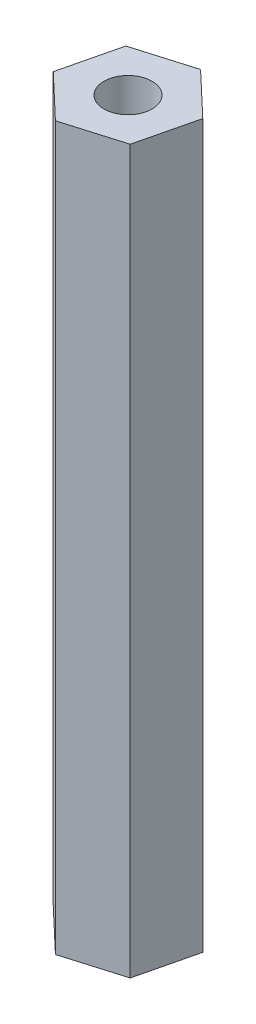
ISO-10303-21;
HEADER;
FILE_DESCRIPTION(('STEP AP214'),'2;1');
FILE_NAME('part.step','',(''),(''),'','','');
FILE_SCHEMA(('AUTOMOTIVE_DESIGN { 1 0 10303 214 1 1 1 1 }'));
ENDSEC;
DATA;
#1=APPLICATION_CONTEXT('core data for automotive mechanical design processes');
#2=APPLICATION_PROTOCOL_DEFINITION('international standard','automotive_design',2000,#1);
#3=PRODUCT_CONTEXT('',#1,'mechanical');
#4=PRODUCT('Part','Part','',(#3));
#5=PRODUCT_RELATED_PRODUCT_CATEGORY('part','',(#4));
#6=PRODUCT_DEFINITION_FORMATION('','',#4);
#7=PRODUCT_DEFINITION_CONTEXT('part definition',#1,'design');
#8=PRODUCT_DEFINITION('design','',#6,#7);
#9=PRODUCT_DEFINITION_SHAPE('','',#8);
#10=(LENGTH_UNIT() NAMED_UNIT(*) SI_UNIT(.MILLI.,.METRE.));
#11=(NAMED_UNIT(*) PLANE_ANGLE_UNIT() SI_UNIT($,.RADIAN.));
#12=(NAMED_UNIT(*) SI_UNIT($,.STERADIAN.) SOLID_ANGLE_UNIT());
#13=UNCERTAINTY_MEASURE_WITH_UNIT(LENGTH_MEASURE(1.E-05),#10,'distance_accuracy_value','');
#14=(GEOMETRIC_REPRESENTATION_CONTEXT(3) GLOBAL_UNCERTAINTY_ASSIGNED_CONTEXT((#13)) GLOBAL_UNIT_ASSIGNED_CONTEXT((#10,
#11,#12)) REPRESENTATION_CONTEXT('',''));
#15=CARTESIAN_POINT('',(0.,0.,0.));
#16=DIRECTION('',(0.,0.,1.));
#17=DIRECTION('',(1.,0.,0.));
#18=AXIS2_PLACEMENT_3D('',#15,#16,#17);
#19=CARTESIAN_POINT('',(0.,60.,0.));
#20=DIRECTION('',(0.,1.,0.));
#21=DIRECTION('',(0.,0.,1.));
#22=AXIS2_PLACEMENT_3D('',#19,#20,#21);
#23=PLANE('',#22);
#24=DIRECTION('',(0.958974247658191,0.,-0.283493196264754));
#25=VECTOR('',#24,1.);
#26=CARTESIAN_POINT('',(-1.16987407031886,60.,4.8612132908972));
#27=LINE('',#26,#25);
#28=CARTESIAN_POINT('',(-1.16987407031886,60.,4.8612132908972));
#29=VERTEX_POINT('',#28);
#30=CARTESIAN_POINT('',(3.6249971679721,60.,3.44374730957343));
#31=VERTEX_POINT('',#30);
#32=EDGE_CURVE('E181',#29,#31,#27,.T.);
#33=ORIENTED_EDGE('',*,*,#32,.T.);
#34=DIRECTION('',(0.233974814063771,0.,-0.97224265817944));
#35=VECTOR('',#34,1.);
#36=CARTESIAN_POINT('',(3.6249971679721,60.,3.44374730957343));
#37=LINE('',#36,#35);
#38=CARTESIAN_POINT('',(4.79487123829096,60.,-1.41746598132377));
#39=VERTEX_POINT('',#38);
#40=EDGE_CURVE('E139',#31,#39,#37,.T.);
#41=ORIENTED_EDGE('',*,*,#40,.T.);
#42=DIRECTION('',(-0.72499943359442,0.,-0.688749461914687));
#43=VECTOR('',#42,1.);
#44=CARTESIAN_POINT('',(4.79487123829096,60.,-1.41746598132377));
#45=LINE('',#44,#43);
#46=CARTESIAN_POINT('',(1.16987407031886,60.,-4.8612132908972));
#47=VERTEX_POINT('',#46);
#48=EDGE_CURVE('E152',#39,#47,#45,.T.);
#49=ORIENTED_EDGE('',*,*,#48,.T.);
#50=DIRECTION('',(-0.958974247658191,0.,0.283493196264754));
#51=VECTOR('',#50,1.);
#52=CARTESIAN_POINT('',(1.16987407031886,60.,-4.8612132908972));
#53=LINE('',#52,#51);
#54=CARTESIAN_POINT('',(-3.6249971679721,60.,-3.44374730957343));
#55=VERTEX_POINT('',#54);
#56=EDGE_CURVE('E146',#47,#55,#53,.T.);
#57=ORIENTED_EDGE('',*,*,#56,.T.);
#58=DIRECTION('',(-0.233974814063771,0.,0.97224265817944));
#59=VECTOR('',#58,1.);
#60=CARTESIAN_POINT('',(-3.6249971679721,60.,-3.44374730957343));
#61=LINE('',#60,#59);
#62=CARTESIAN_POINT('',(-4.79487123829096,60.,1.41746598132377));
#63=VERTEX_POINT('',#62);
#64=EDGE_CURVE('E150',#55,#63,#61,.T.);
#65=ORIENTED_EDGE('',*,*,#64,.T.);
#66=DIRECTION('',(0.72499943359442,0.,0.688749461914687));
#67=VECTOR('',#66,1.);
#68=CARTESIAN_POINT('',(-4.79487123829096,60.,1.41746598132377));
#69=LINE('',#68,#67);
#70=EDGE_CURVE('E102',#63,#29,#69,.T.);
#71=ORIENTED_EDGE('',*,*,#70,.T.);
#72=EDGE_LOOP('',(#33,#41,#49,#57,#65,#71));
#73=FACE_BOUND('',#72,.T.);
#74=CARTESIAN_POINT('',(0.,60.,0.));
#75=DIRECTION('',(0.,1.,0.));
#76=DIRECTION('',(0.,0.,1.));
#77=AXIS2_PLACEMENT_3D('',#74,#75,#76);
#78=CIRCLE('',#77,2.);
#79=CARTESIAN_POINT('',(0.,60.,2.));
#80=VERTEX_POINT('',#79);
#81=EDGE_CURVE('E316',#80,#80,#78,.T.);
#82=ORIENTED_EDGE('',*,*,#81,.F.);
#83=EDGE_LOOP('',(#82));
#84=FACE_BOUND('',#83,.T.);
#85=ADVANCED_FACE('F85',(#73,#84),#23,.T.);
#86=CARTESIAN_POINT('',(0.,0.,0.));
#87=DIRECTION('',(0.,1.,0.));
#88=DIRECTION('',(0.,0.,1.));
#89=AXIS2_PLACEMENT_3D('',#86,#87,#88);
#90=PLANE('',#89);
#91=DIRECTION('',(0.958974247658191,0.,-0.283493196264754));
#92=VECTOR('',#91,1.);
#93=CARTESIAN_POINT('',(-1.16987407031886,0.,4.8612132908972));
#94=LINE('',#93,#92);
#95=CARTESIAN_POINT('',(-1.16987407031886,0.,4.8612132908972));
#96=VERTEX_POINT('',#95);
#97=CARTESIAN_POINT('',(3.6249971679721,0.,3.44374730957343));
#98=VERTEX_POINT('',#97);
#99=EDGE_CURVE('E170',#96,#98,#94,.T.);
#100=ORIENTED_EDGE('',*,*,#99,.F.);
#101=DIRECTION('',(0.72499943359442,0.,0.688749461914687));
#102=VECTOR('',#101,1.);
#103=CARTESIAN_POINT('',(-4.79487123829096,0.,1.41746598132377));
#104=LINE('',#103,#102);
#105=CARTESIAN_POINT('',(-4.79487123829096,0.,1.41746598132377));
#106=VERTEX_POINT('',#105);
#107=EDGE_CURVE('E131',#106,#96,#104,.T.);
#108=ORIENTED_EDGE('',*,*,#107,.F.);
#109=DIRECTION('',(-0.233974814063771,0.,0.97224265817944));
#110=VECTOR('',#109,1.);
#111=CARTESIAN_POINT('',(-3.6249971679721,0.,-3.44374730957343));
#112=LINE('',#111,#110);
#113=CARTESIAN_POINT('',(-3.6249971679721,0.,-3.44374730957343));
#114=VERTEX_POINT('',#113);
#115=EDGE_CURVE('E125',#114,#106,#112,.T.);
#116=ORIENTED_EDGE('',*,*,#115,.F.);
#117=DIRECTION('',(-0.958974247658191,0.,0.283493196264754));
#118=VECTOR('',#117,1.);
#119=CARTESIAN_POINT('',(1.16987407031886,0.,-4.8612132908972));
#120=LINE('',#119,#118);
#121=CARTESIAN_POINT('',(1.16987407031886,0.,-4.8612132908972));
#122=VERTEX_POINT('',#121);
#123=EDGE_CURVE('E160',#122,#114,#120,.T.);
#124=ORIENTED_EDGE('',*,*,#123,.F.);
#125=DIRECTION('',(-0.72499943359442,0.,-0.688749461914687));
#126=VECTOR('',#125,1.);
#127=CARTESIAN_POINT('',(4.79487123829096,0.,-1.41746598132377));
#128=LINE('',#127,#126);
#129=CARTESIAN_POINT('',(4.79487123829096,0.,-1.41746598132377));
#130=VERTEX_POINT('',#129);
#131=EDGE_CURVE('E176',#130,#122,#128,.T.);
#132=ORIENTED_EDGE('',*,*,#131,.F.);
#133=DIRECTION('',(0.233974814063771,0.,-0.97224265817944));
#134=VECTOR('',#133,1.);
#135=CARTESIAN_POINT('',(3.6249971679721,0.,3.44374730957343));
#136=LINE('',#135,#134);
#137=EDGE_CURVE('E173',#98,#130,#136,.T.);
#138=ORIENTED_EDGE('',*,*,#137,.F.);
#139=EDGE_LOOP('',(#100,#108,#116,#124,#132,#138));
#140=FACE_BOUND('',#139,.T.);
#141=CARTESIAN_POINT('',(0.,0.,0.));
#142=DIRECTION('',(0.,1.,0.));
#143=DIRECTION('',(0.,0.,1.));
#144=AXIS2_PLACEMENT_3D('',#141,#142,#143);
#145=CIRCLE('',#144,2.);
#146=CARTESIAN_POINT('',(0.,0.,2.));
#147=VERTEX_POINT('',#146);
#148=EDGE_CURVE('E174',#147,#147,#145,.T.);
#149=ORIENTED_EDGE('',*,*,#148,.T.);
#150=EDGE_LOOP('',(#149));
#151=FACE_BOUND('',#150,.T.);
#152=ADVANCED_FACE('F190',(#140,#151),#90,.F.);
#153=CARTESIAN_POINT('',(-1.16987407031886,60.,4.8612132908972));
#154=DIRECTION('',(-0.283493196264754,0.,-0.958974247658191));
#155=DIRECTION('',(-0.958974247658191,0.,0.283493196264754));
#156=AXIS2_PLACEMENT_3D('',#153,#154,#155);
#157=PLANE('',#156);
#158=ORIENTED_EDGE('',*,*,#99,.T.);
#159=DIRECTION('',(0.,-1.,0.));
#160=VECTOR('',#159,1.);
#161=CARTESIAN_POINT('',(3.6249971679721,60.,3.44374730957343));
#162=LINE('',#161,#160);
#163=EDGE_CURVE('E12',#31,#98,#162,.T.);
#164=ORIENTED_EDGE('',*,*,#163,.F.);
#165=ORIENTED_EDGE('',*,*,#32,.F.);
#166=DIRECTION('',(0.,-1.,0.));
#167=VECTOR('',#166,1.);
#168=CARTESIAN_POINT('',(-1.16987407031886,60.,4.8612132908972));
#169=LINE('',#168,#167);
#170=EDGE_CURVE('E166',#29,#96,#169,.T.);
#171=ORIENTED_EDGE('',*,*,#170,.T.);
#172=EDGE_LOOP('',(#158,#164,#165,#171));
#173=FACE_BOUND('',#172,.T.);
#174=ADVANCED_FACE('F87',(#173),#157,.F.);
#175=CARTESIAN_POINT('',(3.6249971679721,60.,3.44374730957343));
#176=DIRECTION('',(-0.97224265817944,0.,-0.233974814063771));
#177=DIRECTION('',(-0.233974814063771,0.,0.97224265817944));
#178=AXIS2_PLACEMENT_3D('',#175,#176,#177);
#179=PLANE('',#178);
#180=ORIENTED_EDGE('',*,*,#137,.T.);
#181=DIRECTION('',(0.,-1.,0.));
#182=VECTOR('',#181,1.);
#183=CARTESIAN_POINT('',(4.79487123829096,60.,-1.41746598132377));
#184=LINE('',#183,#182);
#185=EDGE_CURVE('E94',#39,#130,#184,.T.);
#186=ORIENTED_EDGE('',*,*,#185,.F.);
#187=ORIENTED_EDGE('',*,*,#40,.F.);
#188=ORIENTED_EDGE('',*,*,#163,.T.);
#189=EDGE_LOOP('',(#180,#186,#187,#188));
#190=FACE_BOUND('',#189,.T.);
#191=ADVANCED_FACE('F215',(#190),#179,.F.);
#192=CARTESIAN_POINT('',(4.79487123829096,60.,-1.41746598132377));
#193=DIRECTION('',(-0.688749461914687,0.,0.72499943359442));
#194=DIRECTION('',(0.72499943359442,0.,0.688749461914687));
#195=AXIS2_PLACEMENT_3D('',#192,#193,#194);
#196=PLANE('',#195);
#197=ORIENTED_EDGE('',*,*,#131,.T.);
#198=DIRECTION('',(0.,-1.,0.));
#199=VECTOR('',#198,1.);
#200=CARTESIAN_POINT('',(1.16987407031886,60.,-4.8612132908972));
#201=LINE('',#200,#199);
#202=EDGE_CURVE('E161',#47,#122,#201,.T.);
#203=ORIENTED_EDGE('',*,*,#202,.F.);
#204=ORIENTED_EDGE('',*,*,#48,.F.);
#205=ORIENTED_EDGE('',*,*,#185,.T.);
#206=EDGE_LOOP('',(#197,#203,#204,#205));
#207=FACE_BOUND('',#206,.T.);
#208=ADVANCED_FACE('F187',(#207),#196,.F.);
#209=CARTESIAN_POINT('',(1.16987407031886,60.,-4.8612132908972));
#210=DIRECTION('',(0.283493196264754,0.,0.958974247658191));
#211=DIRECTION('',(0.958974247658191,0.,-0.283493196264754));
#212=AXIS2_PLACEMENT_3D('',#209,#210,#211);
#213=PLANE('',#212);
#214=ORIENTED_EDGE('',*,*,#123,.T.);
#215=DIRECTION('',(0.,-1.,0.));
#216=VECTOR('',#215,1.);
#217=CARTESIAN_POINT('',(-3.6249971679721,60.,-3.44374730957343));
#218=LINE('',#217,#216);
#219=EDGE_CURVE('E157',#55,#114,#218,.T.);
#220=ORIENTED_EDGE('',*,*,#219,.F.);
#221=ORIENTED_EDGE('',*,*,#56,.F.);
#222=ORIENTED_EDGE('',*,*,#202,.T.);
#223=EDGE_LOOP('',(#214,#220,#221,#222));
#224=FACE_BOUND('',#223,.T.);
#225=ADVANCED_FACE('F158',(#224),#213,.F.);
#226=CARTESIAN_POINT('',(-3.6249971679721,60.,-3.44374730957343));
#227=DIRECTION('',(0.97224265817944,0.,0.233974814063771));
#228=DIRECTION('',(0.233974814063771,0.,-0.97224265817944));
#229=AXIS2_PLACEMENT_3D('',#226,#227,#228);
#230=PLANE('',#229);
#231=ORIENTED_EDGE('',*,*,#115,.T.);
#232=DIRECTION('',(0.,-1.,0.));
#233=VECTOR('',#232,1.);
#234=CARTESIAN_POINT('',(-4.79487123829096,60.,1.41746598132377));
#235=LINE('',#234,#233);
#236=EDGE_CURVE('E162',#63,#106,#235,.T.);
#237=ORIENTED_EDGE('',*,*,#236,.F.);
#238=ORIENTED_EDGE('',*,*,#64,.F.);
#239=ORIENTED_EDGE('',*,*,#219,.T.);
#240=EDGE_LOOP('',(#231,#237,#238,#239));
#241=FACE_BOUND('',#240,.T.);
#242=ADVANCED_FACE('F164',(#241),#230,.F.);
#243=CARTESIAN_POINT('',(-4.79487123829096,60.,1.41746598132377));
#244=DIRECTION('',(0.688749461914687,0.,-0.72499943359442));
#245=DIRECTION('',(-0.72499943359442,0.,-0.688749461914687));
#246=AXIS2_PLACEMENT_3D('',#243,#244,#245);
#247=PLANE('',#246);
#248=ORIENTED_EDGE('',*,*,#107,.T.);
#249=ORIENTED_EDGE('',*,*,#170,.F.);
#250=ORIENTED_EDGE('',*,*,#70,.F.);
#251=ORIENTED_EDGE('',*,*,#236,.T.);
#252=EDGE_LOOP('',(#248,#249,#250,#251));
#253=FACE_BOUND('',#252,.T.);
#254=ADVANCED_FACE('F195',(#253),#247,.F.);
#255=CARTESIAN_POINT('',(0.,0.,0.));
#256=DIRECTION('',(0.,1.,0.));
#257=DIRECTION('',(0.,0.,1.));
#258=AXIS2_PLACEMENT_3D('',#255,#256,#257);
#259=CYLINDRICAL_SURFACE('',#258,2.);
#260=ORIENTED_EDGE('',*,*,#148,.F.);
#261=EDGE_LOOP('',(#260));
#262=FACE_BOUND('',#261,.T.);
#263=ORIENTED_EDGE('',*,*,#81,.T.);
#264=EDGE_LOOP('',(#263));
#265=FACE_BOUND('',#264,.T.);
#266=ADVANCED_FACE('F197',(#262,#265),#259,.F.);
#267=CLOSED_SHELL('',(#85,#152,#174,#191,#208,#225,#242,#254,#266));
#268=MANIFOLD_SOLID_BREP('B2',#267);
#269=ADVANCED_BREP_SHAPE_REPRESENTATION('',(#18,#268),#14);
#270=SHAPE_DEFINITION_REPRESENTATION(#9,#269);
ENDSEC;
END-ISO-10303-21;
